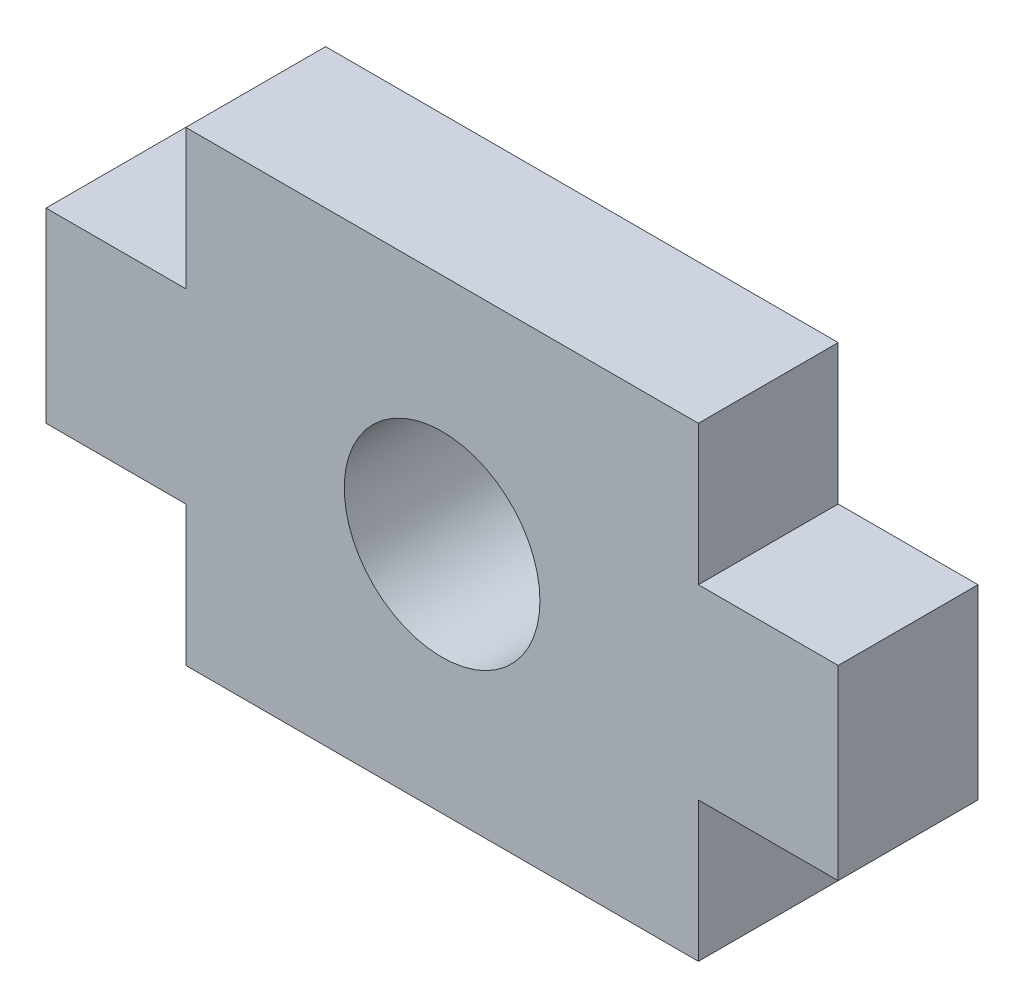
ISO-10303-21;
HEADER;
FILE_DESCRIPTION(('STEP AP214'),'2;1');
FILE_NAME('part.step','',(''),(''),'','','');
FILE_SCHEMA(('AUTOMOTIVE_DESIGN { 1 0 10303 214 1 1 1 1 }'));
ENDSEC;
DATA;
#1=APPLICATION_CONTEXT('core data for automotive mechanical design processes');
#2=APPLICATION_PROTOCOL_DEFINITION('international standard','automotive_design',2000,#1);
#3=PRODUCT_CONTEXT('',#1,'mechanical');
#4=PRODUCT('Part','Part','',(#3));
#5=PRODUCT_RELATED_PRODUCT_CATEGORY('part','',(#4));
#6=PRODUCT_DEFINITION_FORMATION('','',#4);
#7=PRODUCT_DEFINITION_CONTEXT('part definition',#1,'design');
#8=PRODUCT_DEFINITION('design','',#6,#7);
#9=PRODUCT_DEFINITION_SHAPE('','',#8);
#10=(LENGTH_UNIT() NAMED_UNIT(*) SI_UNIT(.MILLI.,.METRE.));
#11=(NAMED_UNIT(*) PLANE_ANGLE_UNIT() SI_UNIT($,.RADIAN.));
#12=(NAMED_UNIT(*) SI_UNIT($,.STERADIAN.) SOLID_ANGLE_UNIT());
#13=UNCERTAINTY_MEASURE_WITH_UNIT(LENGTH_MEASURE(1.E-05),#10,'distance_accuracy_value','');
#14=(GEOMETRIC_REPRESENTATION_CONTEXT(3) GLOBAL_UNCERTAINTY_ASSIGNED_CONTEXT((#13)) GLOBAL_UNIT_ASSIGNED_CONTEXT((#10,
#11,#12)) REPRESENTATION_CONTEXT('',''));
#15=CARTESIAN_POINT('',(0.,0.,0.));
#16=DIRECTION('',(0.,0.,1.));
#17=DIRECTION('',(1.,0.,0.));
#18=AXIS2_PLACEMENT_3D('',#15,#16,#17);
#19=CARTESIAN_POINT('',(5.5,5.,1.5));
#20=DIRECTION('',(-1.,0.,0.));
#21=DIRECTION('',(0.,0.,1.));
#22=AXIS2_PLACEMENT_3D('',#19,#20,#21);
#23=PLANE('',#22);
#24=DIRECTION('',(0.,0.,-1.));
#25=VECTOR('',#24,1.);
#26=CARTESIAN_POINT('',(5.5,-2.,1.5));
#27=LINE('',#26,#25);
#28=CARTESIAN_POINT('',(5.5,-2.,1.5));
#29=VERTEX_POINT('',#28);
#30=CARTESIAN_POINT('',(5.5,-2.,-1.5));
#31=VERTEX_POINT('',#30);
#32=EDGE_CURVE('E143',#29,#31,#27,.T.);
#33=ORIENTED_EDGE('',*,*,#32,.F.);
#34=DIRECTION('',(0.,1.,0.));
#35=VECTOR('',#34,1.);
#36=CARTESIAN_POINT('',(5.5,5.,1.5));
#37=LINE('',#36,#35);
#38=CARTESIAN_POINT('',(5.5,-5.,1.5));
#39=VERTEX_POINT('',#38);
#40=EDGE_CURVE('E149',#39,#29,#37,.T.);
#41=ORIENTED_EDGE('',*,*,#40,.F.);
#42=DIRECTION('',(0.,0.,-1.));
#43=VECTOR('',#42,1.);
#44=CARTESIAN_POINT('',(5.5,-5.,1.5));
#45=LINE('',#44,#43);
#46=CARTESIAN_POINT('',(5.5,-5.,-1.5));
#47=VERTEX_POINT('',#46);
#48=EDGE_CURVE('E43',#39,#47,#45,.T.);
#49=ORIENTED_EDGE('',*,*,#48,.T.);
#50=DIRECTION('',(0.,1.,0.));
#51=VECTOR('',#50,1.);
#52=CARTESIAN_POINT('',(5.5,5.,-1.5));
#53=LINE('',#52,#51);
#54=EDGE_CURVE('E167',#47,#31,#53,.T.);
#55=ORIENTED_EDGE('',*,*,#54,.T.);
#56=EDGE_LOOP('',(#33,#41,#49,#55));
#57=FACE_BOUND('',#56,.T.);
#58=ADVANCED_FACE('F35',(#57),#23,.F.);
#59=CARTESIAN_POINT('',(-5.5,5.,1.5));
#60=DIRECTION('',(1.,0.,0.));
#61=DIRECTION('',(0.,1.,0.));
#62=AXIS2_PLACEMENT_3D('',#59,#60,#61);
#63=PLANE('',#62);
#64=DIRECTION('',(0.,0.,-1.));
#65=VECTOR('',#64,1.);
#66=CARTESIAN_POINT('',(-5.5,2.,1.5));
#67=LINE('',#66,#65);
#68=CARTESIAN_POINT('',(-5.5,2.,1.5));
#69=VERTEX_POINT('',#68);
#70=CARTESIAN_POINT('',(-5.5,2.,-1.5));
#71=VERTEX_POINT('',#70);
#72=EDGE_CURVE('E220',#69,#71,#67,.T.);
#73=ORIENTED_EDGE('',*,*,#72,.F.);
#74=DIRECTION('',(0.,-1.,0.));
#75=VECTOR('',#74,1.);
#76=CARTESIAN_POINT('',(-5.5,5.,1.5));
#77=LINE('',#76,#75);
#78=CARTESIAN_POINT('',(-5.5,5.,1.5));
#79=VERTEX_POINT('',#78);
#80=EDGE_CURVE('E154',#79,#69,#77,.T.);
#81=ORIENTED_EDGE('',*,*,#80,.F.);
#82=DIRECTION('',(0.,0.,-1.));
#83=VECTOR('',#82,1.);
#84=CARTESIAN_POINT('',(-5.5,5.,1.5));
#85=LINE('',#84,#83);
#86=CARTESIAN_POINT('',(-5.5,5.,-1.5));
#87=VERTEX_POINT('',#86);
#88=EDGE_CURVE('E159',#79,#87,#85,.T.);
#89=ORIENTED_EDGE('',*,*,#88,.T.);
#90=DIRECTION('',(0.,-1.,0.));
#91=VECTOR('',#90,1.);
#92=CARTESIAN_POINT('',(-5.5,5.,-1.5));
#93=LINE('',#92,#91);
#94=EDGE_CURVE('E160',#87,#71,#93,.T.);
#95=ORIENTED_EDGE('',*,*,#94,.T.);
#96=EDGE_LOOP('',(#73,#81,#89,#95));
#97=FACE_BOUND('',#96,.T.);
#98=ADVANCED_FACE('F243',(#97),#63,.F.);
#99=CARTESIAN_POINT('',(-5.5,-2.,1.5));
#100=VERTEX_POINT('',#99);
#101=CARTESIAN_POINT('',(-5.5,-5.,1.5));
#102=VERTEX_POINT('',#101);
#103=EDGE_CURVE('E172',#100,#102,#77,.T.);
#104=ORIENTED_EDGE('',*,*,#103,.F.);
#105=DIRECTION('',(0.,0.,-1.));
#106=VECTOR('',#105,1.);
#107=CARTESIAN_POINT('',(-5.5,-2.,1.5));
#108=LINE('',#107,#106);
#109=CARTESIAN_POINT('',(-5.5,-2.,-1.5));
#110=VERTEX_POINT('',#109);
#111=EDGE_CURVE('E222',#100,#110,#108,.T.);
#112=ORIENTED_EDGE('',*,*,#111,.T.);
#113=CARTESIAN_POINT('',(-5.5,-5.,-1.5));
#114=VERTEX_POINT('',#113);
#115=EDGE_CURVE('E164',#110,#114,#93,.T.);
#116=ORIENTED_EDGE('',*,*,#115,.T.);
#117=DIRECTION('',(0.,0.,-1.));
#118=VECTOR('',#117,1.);
#119=CARTESIAN_POINT('',(-5.5,-5.,1.5));
#120=LINE('',#119,#118);
#121=EDGE_CURVE('E11',#102,#114,#120,.T.);
#122=ORIENTED_EDGE('',*,*,#121,.F.);
#123=EDGE_LOOP('',(#104,#112,#116,#122));
#124=FACE_BOUND('',#123,.T.);
#125=ADVANCED_FACE('F37',(#124),#63,.F.);
#126=CARTESIAN_POINT('',(-5.5,-5.,1.5));
#127=DIRECTION('',(0.,1.,0.));
#128=DIRECTION('',(0.,0.,1.));
#129=AXIS2_PLACEMENT_3D('',#126,#127,#128);
#130=PLANE('',#129);
#131=DIRECTION('',(1.,0.,0.));
#132=VECTOR('',#131,1.);
#133=CARTESIAN_POINT('',(-5.5,-5.,-1.5));
#134=LINE('',#133,#132);
#135=EDGE_CURVE('E163',#114,#47,#134,.T.);
#136=ORIENTED_EDGE('',*,*,#135,.T.);
#137=ORIENTED_EDGE('',*,*,#48,.F.);
#138=DIRECTION('',(1.,0.,0.));
#139=VECTOR('',#138,1.);
#140=CARTESIAN_POINT('',(-5.5,-5.,1.5));
#141=LINE('',#140,#139);
#142=EDGE_CURVE('E150',#102,#39,#141,.T.);
#143=ORIENTED_EDGE('',*,*,#142,.F.);
#144=ORIENTED_EDGE('',*,*,#121,.T.);
#145=EDGE_LOOP('',(#136,#137,#143,#144));
#146=FACE_BOUND('',#145,.T.);
#147=ADVANCED_FACE('F229',(#146),#130,.F.);
#148=CARTESIAN_POINT('',(5.5,2.,1.5));
#149=VERTEX_POINT('',#148);
#150=CARTESIAN_POINT('',(5.5,5.,1.5));
#151=VERTEX_POINT('',#150);
#152=EDGE_CURVE('E130',#149,#151,#37,.T.);
#153=ORIENTED_EDGE('',*,*,#152,.F.);
#154=DIRECTION('',(0.,0.,-1.));
#155=VECTOR('',#154,1.);
#156=CARTESIAN_POINT('',(5.5,2.,1.5));
#157=LINE('',#156,#155);
#158=CARTESIAN_POINT('',(5.5,2.,-1.5));
#159=VERTEX_POINT('',#158);
#160=EDGE_CURVE('E138',#149,#159,#157,.T.);
#161=ORIENTED_EDGE('',*,*,#160,.T.);
#162=CARTESIAN_POINT('',(5.5,5.,-1.5));
#163=VERTEX_POINT('',#162);
#164=EDGE_CURVE('E166',#159,#163,#53,.T.);
#165=ORIENTED_EDGE('',*,*,#164,.T.);
#166=DIRECTION('',(0.,0.,-1.));
#167=VECTOR('',#166,1.);
#168=CARTESIAN_POINT('',(5.5,5.,1.5));
#169=LINE('',#168,#167);
#170=EDGE_CURVE('E147',#151,#163,#169,.T.);
#171=ORIENTED_EDGE('',*,*,#170,.F.);
#172=EDGE_LOOP('',(#153,#161,#165,#171));
#173=FACE_BOUND('',#172,.T.);
#174=ADVANCED_FACE('F145',(#173),#23,.F.);
#175=CARTESIAN_POINT('',(-5.5,5.,1.5));
#176=DIRECTION('',(0.,-1.,0.));
#177=DIRECTION('',(0.,0.,-1.));
#178=AXIS2_PLACEMENT_3D('',#175,#176,#177);
#179=PLANE('',#178);
#180=DIRECTION('',(-1.,0.,0.));
#181=VECTOR('',#180,1.);
#182=CARTESIAN_POINT('',(-5.5,5.,-1.5));
#183=LINE('',#182,#181);
#184=EDGE_CURVE('E170',#163,#87,#183,.T.);
#185=ORIENTED_EDGE('',*,*,#184,.T.);
#186=ORIENTED_EDGE('',*,*,#88,.F.);
#187=DIRECTION('',(-1.,0.,0.));
#188=VECTOR('',#187,1.);
#189=CARTESIAN_POINT('',(-5.5,5.,1.5));
#190=LINE('',#189,#188);
#191=EDGE_CURVE('E153',#151,#79,#190,.T.);
#192=ORIENTED_EDGE('',*,*,#191,.F.);
#193=ORIENTED_EDGE('',*,*,#170,.T.);
#194=EDGE_LOOP('',(#185,#186,#192,#193));
#195=FACE_BOUND('',#194,.T.);
#196=ADVANCED_FACE('F246',(#195),#179,.F.);
#197=CARTESIAN_POINT('',(0.,0.,1.5));
#198=DIRECTION('',(0.,0.,1.));
#199=DIRECTION('',(1.,0.,0.));
#200=AXIS2_PLACEMENT_3D('',#197,#198,#199);
#201=PLANE('',#200);
#202=CARTESIAN_POINT('',(0.,0.,1.5));
#203=DIRECTION('',(0.,0.,1.));
#204=DIRECTION('',(1.,0.,0.));
#205=AXIS2_PLACEMENT_3D('',#202,#203,#204);
#206=CIRCLE('',#205,2.1);
#207=CARTESIAN_POINT('',(2.1,0.,1.5));
#208=VERTEX_POINT('',#207);
#209=EDGE_CURVE('E379',#208,#208,#206,.T.);
#210=ORIENTED_EDGE('',*,*,#209,.F.);
#211=EDGE_LOOP('',(#210));
#212=FACE_BOUND('',#211,.T.);
#213=ORIENTED_EDGE('',*,*,#80,.T.);
#214=DIRECTION('',(-1.,0.,0.));
#215=VECTOR('',#214,1.);
#216=CARTESIAN_POINT('',(-8.5,2.,1.5));
#217=LINE('',#216,#215);
#218=CARTESIAN_POINT('',(-8.5,2.,1.5));
#219=VERTEX_POINT('',#218);
#220=EDGE_CURVE('E211',#69,#219,#217,.T.);
#221=ORIENTED_EDGE('',*,*,#220,.T.);
#222=DIRECTION('',(0.,-1.,0.));
#223=VECTOR('',#222,1.);
#224=CARTESIAN_POINT('',(-8.5,2.,1.5));
#225=LINE('',#224,#223);
#226=CARTESIAN_POINT('',(-8.5,-2.,1.5));
#227=VERTEX_POINT('',#226);
#228=EDGE_CURVE('E205',#219,#227,#225,.T.);
#229=ORIENTED_EDGE('',*,*,#228,.T.);
#230=DIRECTION('',(1.,0.,0.));
#231=VECTOR('',#230,1.);
#232=CARTESIAN_POINT('',(-8.5,-2.,1.5));
#233=LINE('',#232,#231);
#234=EDGE_CURVE('E208',#227,#100,#233,.T.);
#235=ORIENTED_EDGE('',*,*,#234,.T.);
#236=ORIENTED_EDGE('',*,*,#103,.T.);
#237=ORIENTED_EDGE('',*,*,#142,.T.);
#238=ORIENTED_EDGE('',*,*,#40,.T.);
#239=DIRECTION('',(1.,0.,0.));
#240=VECTOR('',#239,1.);
#241=CARTESIAN_POINT('',(8.5,-2.,1.5));
#242=LINE('',#241,#240);
#243=CARTESIAN_POINT('',(8.5,-2.,1.5));
#244=VERTEX_POINT('',#243);
#245=EDGE_CURVE('E135',#29,#244,#242,.T.);
#246=ORIENTED_EDGE('',*,*,#245,.T.);
#247=DIRECTION('',(0.,1.,0.));
#248=VECTOR('',#247,1.);
#249=CARTESIAN_POINT('',(8.5,2.,1.5));
#250=LINE('',#249,#248);
#251=CARTESIAN_POINT('',(8.5,2.,1.5));
#252=VERTEX_POINT('',#251);
#253=EDGE_CURVE('E133',#244,#252,#250,.T.);
#254=ORIENTED_EDGE('',*,*,#253,.T.);
#255=DIRECTION('',(-1.,0.,0.));
#256=VECTOR('',#255,1.);
#257=CARTESIAN_POINT('',(8.5,2.,1.5));
#258=LINE('',#257,#256);
#259=EDGE_CURVE('E126',#252,#149,#258,.T.);
#260=ORIENTED_EDGE('',*,*,#259,.T.);
#261=ORIENTED_EDGE('',*,*,#152,.T.);
#262=ORIENTED_EDGE('',*,*,#191,.T.);
#263=EDGE_LOOP('',(#213,#221,#229,#235,#236,#237,#238,#246,#254,#260,#261,#262));
#264=FACE_BOUND('',#263,.T.);
#265=ADVANCED_FACE('F128',(#212,#264),#201,.T.);
#266=CARTESIAN_POINT('',(0.,0.,-1.5));
#267=DIRECTION('',(0.,0.,1.));
#268=DIRECTION('',(1.,0.,0.));
#269=AXIS2_PLACEMENT_3D('',#266,#267,#268);
#270=PLANE('',#269);
#271=CARTESIAN_POINT('',(0.,0.,-1.5));
#272=DIRECTION('',(0.,0.,1.));
#273=DIRECTION('',(1.,0.,0.));
#274=AXIS2_PLACEMENT_3D('',#271,#272,#273);
#275=CIRCLE('',#274,2.1);
#276=CARTESIAN_POINT('',(2.1,0.,-1.5));
#277=VERTEX_POINT('',#276);
#278=EDGE_CURVE('E196',#277,#277,#275,.T.);
#279=ORIENTED_EDGE('',*,*,#278,.T.);
#280=EDGE_LOOP('',(#279));
#281=FACE_BOUND('',#280,.T.);
#282=ORIENTED_EDGE('',*,*,#94,.F.);
#283=ORIENTED_EDGE('',*,*,#184,.F.);
#284=ORIENTED_EDGE('',*,*,#164,.F.);
#285=DIRECTION('',(-1.,0.,0.));
#286=VECTOR('',#285,1.);
#287=CARTESIAN_POINT('',(8.5,2.,-1.5));
#288=LINE('',#287,#286);
#289=CARTESIAN_POINT('',(8.5,2.,-1.5));
#290=VERTEX_POINT('',#289);
#291=EDGE_CURVE('E50',#290,#159,#288,.T.);
#292=ORIENTED_EDGE('',*,*,#291,.F.);
#293=DIRECTION('',(0.,1.,0.));
#294=VECTOR('',#293,1.);
#295=CARTESIAN_POINT('',(8.5,2.,-1.5));
#296=LINE('',#295,#294);
#297=CARTESIAN_POINT('',(8.5,-2.,-1.5));
#298=VERTEX_POINT('',#297);
#299=EDGE_CURVE('E136',#298,#290,#296,.T.);
#300=ORIENTED_EDGE('',*,*,#299,.F.);
#301=DIRECTION('',(1.,0.,0.));
#302=VECTOR('',#301,1.);
#303=CARTESIAN_POINT('',(8.5,-2.,-1.5));
#304=LINE('',#303,#302);
#305=EDGE_CURVE('E190',#31,#298,#304,.T.);
#306=ORIENTED_EDGE('',*,*,#305,.F.);
#307=ORIENTED_EDGE('',*,*,#54,.F.);
#308=ORIENTED_EDGE('',*,*,#135,.F.);
#309=ORIENTED_EDGE('',*,*,#115,.F.);
#310=DIRECTION('',(1.,0.,0.));
#311=VECTOR('',#310,1.);
#312=CARTESIAN_POINT('',(-8.5,-2.,-1.5));
#313=LINE('',#312,#311);
#314=CARTESIAN_POINT('',(-8.5,-2.,-1.5));
#315=VERTEX_POINT('',#314);
#316=EDGE_CURVE('E58',#315,#110,#313,.T.);
#317=ORIENTED_EDGE('',*,*,#316,.F.);
#318=DIRECTION('',(0.,-1.,0.));
#319=VECTOR('',#318,1.);
#320=CARTESIAN_POINT('',(-8.5,2.,-1.5));
#321=LINE('',#320,#319);
#322=CARTESIAN_POINT('',(-8.5,2.,-1.5));
#323=VERTEX_POINT('',#322);
#324=EDGE_CURVE('E142',#323,#315,#321,.T.);
#325=ORIENTED_EDGE('',*,*,#324,.F.);
#326=DIRECTION('',(-1.,0.,0.));
#327=VECTOR('',#326,1.);
#328=CARTESIAN_POINT('',(-8.5,2.,-1.5));
#329=LINE('',#328,#327);
#330=EDGE_CURVE('E209',#71,#323,#329,.T.);
#331=ORIENTED_EDGE('',*,*,#330,.F.);
#332=EDGE_LOOP('',(#282,#283,#284,#292,#300,#306,#307,#308,#309,#317,#325,#331));
#333=FACE_BOUND('',#332,.T.);
#334=ADVANCED_FACE('F187',(#281,#333),#270,.F.);
#335=CARTESIAN_POINT('',(-8.5,2.,1.5));
#336=DIRECTION('',(1.,0.,0.));
#337=DIRECTION('',(0.,0.,-1.));
#338=AXIS2_PLACEMENT_3D('',#335,#336,#337);
#339=PLANE('',#338);
#340=ORIENTED_EDGE('',*,*,#324,.T.);
#341=DIRECTION('',(0.,0.,-1.));
#342=VECTOR('',#341,1.);
#343=CARTESIAN_POINT('',(-8.5,-2.,1.5));
#344=LINE('',#343,#342);
#345=EDGE_CURVE('E224',#227,#315,#344,.T.);
#346=ORIENTED_EDGE('',*,*,#345,.F.);
#347=ORIENTED_EDGE('',*,*,#228,.F.);
#348=DIRECTION('',(0.,0.,-1.));
#349=VECTOR('',#348,1.);
#350=CARTESIAN_POINT('',(-8.5,2.,1.5));
#351=LINE('',#350,#349);
#352=EDGE_CURVE('E213',#219,#323,#351,.T.);
#353=ORIENTED_EDGE('',*,*,#352,.T.);
#354=EDGE_LOOP('',(#340,#346,#347,#353));
#355=FACE_BOUND('',#354,.T.);
#356=ADVANCED_FACE('F236',(#355),#339,.F.);
#357=CARTESIAN_POINT('',(-8.5,-2.,1.5));
#358=DIRECTION('',(0.,1.,0.));
#359=DIRECTION('',(0.,0.,1.));
#360=AXIS2_PLACEMENT_3D('',#357,#358,#359);
#361=PLANE('',#360);
#362=ORIENTED_EDGE('',*,*,#316,.T.);
#363=ORIENTED_EDGE('',*,*,#111,.F.);
#364=ORIENTED_EDGE('',*,*,#234,.F.);
#365=ORIENTED_EDGE('',*,*,#345,.T.);
#366=EDGE_LOOP('',(#362,#363,#364,#365));
#367=FACE_BOUND('',#366,.T.);
#368=ADVANCED_FACE('F233',(#367),#361,.F.);
#369=CARTESIAN_POINT('',(-8.5,2.,1.5));
#370=DIRECTION('',(0.,-1.,0.));
#371=DIRECTION('',(0.,0.,-1.));
#372=AXIS2_PLACEMENT_3D('',#369,#370,#371);
#373=PLANE('',#372);
#374=ORIENTED_EDGE('',*,*,#330,.T.);
#375=ORIENTED_EDGE('',*,*,#352,.F.);
#376=ORIENTED_EDGE('',*,*,#220,.F.);
#377=ORIENTED_EDGE('',*,*,#72,.T.);
#378=EDGE_LOOP('',(#374,#375,#376,#377));
#379=FACE_BOUND('',#378,.T.);
#380=ADVANCED_FACE('F239',(#379),#373,.F.);
#381=CARTESIAN_POINT('',(8.5,2.,1.5));
#382=DIRECTION('',(0.,-1.,0.));
#383=DIRECTION('',(0.,0.,-1.));
#384=AXIS2_PLACEMENT_3D('',#381,#382,#383);
#385=PLANE('',#384);
#386=ORIENTED_EDGE('',*,*,#291,.T.);
#387=ORIENTED_EDGE('',*,*,#160,.F.);
#388=ORIENTED_EDGE('',*,*,#259,.F.);
#389=DIRECTION('',(0.,0.,-1.));
#390=VECTOR('',#389,1.);
#391=CARTESIAN_POINT('',(8.5,2.,1.5));
#392=LINE('',#391,#390);
#393=EDGE_CURVE('E200',#252,#290,#392,.T.);
#394=ORIENTED_EDGE('',*,*,#393,.T.);
#395=EDGE_LOOP('',(#386,#387,#388,#394));
#396=FACE_BOUND('',#395,.T.);
#397=ADVANCED_FACE('F139',(#396),#385,.F.);
#398=CARTESIAN_POINT('',(8.5,-2.,1.5));
#399=DIRECTION('',(0.,1.,0.));
#400=DIRECTION('',(0.,0.,1.));
#401=AXIS2_PLACEMENT_3D('',#398,#399,#400);
#402=PLANE('',#401);
#403=ORIENTED_EDGE('',*,*,#305,.T.);
#404=DIRECTION('',(0.,0.,-1.));
#405=VECTOR('',#404,1.);
#406=CARTESIAN_POINT('',(8.5,-2.,1.5));
#407=LINE('',#406,#405);
#408=EDGE_CURVE('E202',#244,#298,#407,.T.);
#409=ORIENTED_EDGE('',*,*,#408,.F.);
#410=ORIENTED_EDGE('',*,*,#245,.F.);
#411=ORIENTED_EDGE('',*,*,#32,.T.);
#412=EDGE_LOOP('',(#403,#409,#410,#411));
#413=FACE_BOUND('',#412,.T.);
#414=ADVANCED_FACE('F329',(#413),#402,.F.);
#415=CARTESIAN_POINT('',(8.5,2.,1.5));
#416=DIRECTION('',(-1.,0.,0.));
#417=DIRECTION('',(0.,0.,1.));
#418=AXIS2_PLACEMENT_3D('',#415,#416,#417);
#419=PLANE('',#418);
#420=ORIENTED_EDGE('',*,*,#299,.T.);
#421=ORIENTED_EDGE('',*,*,#393,.F.);
#422=ORIENTED_EDGE('',*,*,#253,.F.);
#423=ORIENTED_EDGE('',*,*,#408,.T.);
#424=EDGE_LOOP('',(#420,#421,#422,#423));
#425=FACE_BOUND('',#424,.T.);
#426=ADVANCED_FACE('F338',(#425),#419,.F.);
#427=CARTESIAN_POINT('',(0.,0.,-1.5));
#428=DIRECTION('',(0.,0.,1.));
#429=DIRECTION('',(1.,0.,0.));
#430=AXIS2_PLACEMENT_3D('',#427,#428,#429);
#431=CYLINDRICAL_SURFACE('',#430,2.1);
#432=ORIENTED_EDGE('',*,*,#278,.F.);
#433=EDGE_LOOP('',(#432));
#434=FACE_BOUND('',#433,.T.);
#435=ORIENTED_EDGE('',*,*,#209,.T.);
#436=EDGE_LOOP('',(#435));
#437=FACE_BOUND('',#436,.T.);
#438=ADVANCED_FACE('F347',(#434,#437),#431,.F.);
#439=CLOSED_SHELL('',(#58,#98,#125,#147,#174,#196,#265,#334,#356,#368,#380,#397,#414,#426,#438));
#440=MANIFOLD_SOLID_BREP('B2',#439);
#441=ADVANCED_BREP_SHAPE_REPRESENTATION('',(#18,#440),#14);
#442=SHAPE_DEFINITION_REPRESENTATION(#9,#441);
ENDSEC;
END-ISO-10303-21;
